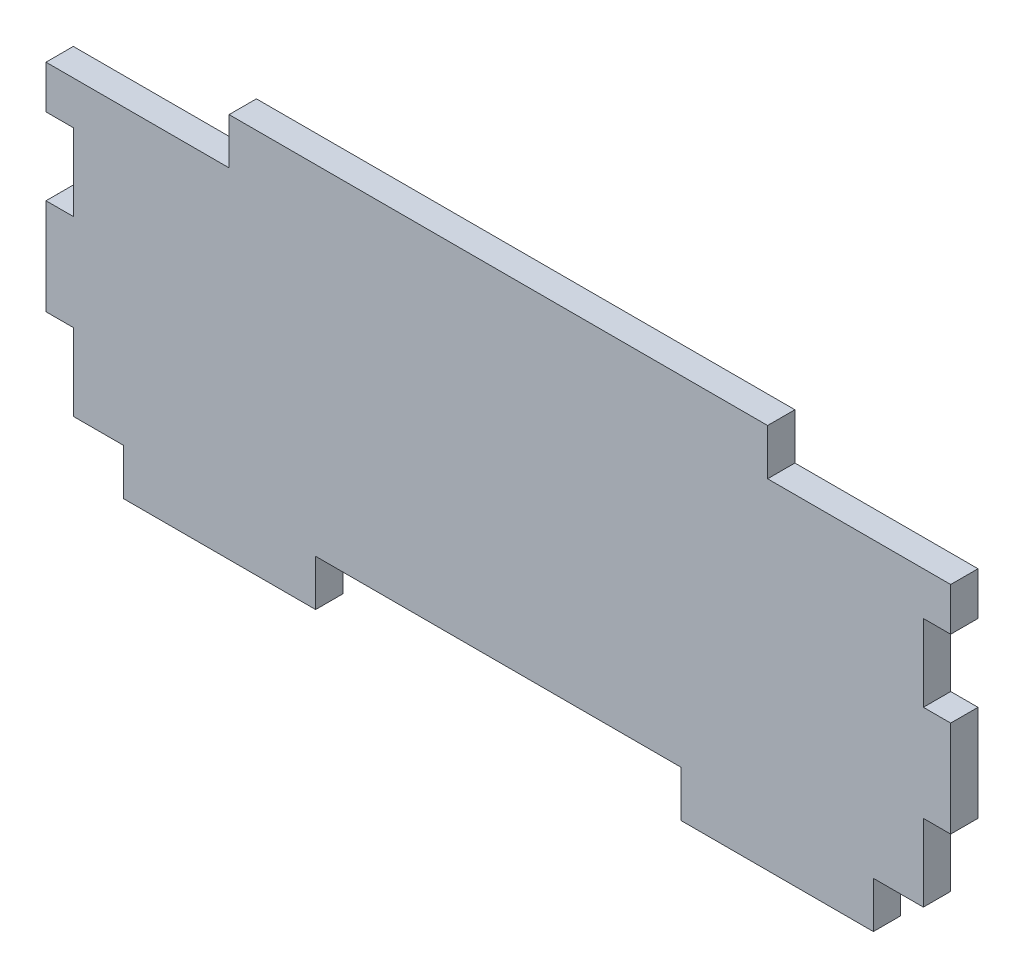
ISO-10303-21;
HEADER;
FILE_DESCRIPTION(('STEP AP214'),'2;1');
FILE_NAME('part.step','',(''),(''),'','','');
FILE_SCHEMA(('AUTOMOTIVE_DESIGN { 1 0 10303 214 1 1 1 1 }'));
ENDSEC;
DATA;
#1=APPLICATION_CONTEXT('core data for automotive mechanical design processes');
#2=APPLICATION_PROTOCOL_DEFINITION('international standard','automotive_design',2000,#1);
#3=PRODUCT_CONTEXT('',#1,'mechanical');
#4=PRODUCT('Part','Part','',(#3));
#5=PRODUCT_RELATED_PRODUCT_CATEGORY('part','',(#4));
#6=PRODUCT_DEFINITION_FORMATION('','',#4);
#7=PRODUCT_DEFINITION_CONTEXT('part definition',#1,'design');
#8=PRODUCT_DEFINITION('design','',#6,#7);
#9=PRODUCT_DEFINITION_SHAPE('','',#8);
#10=(LENGTH_UNIT() NAMED_UNIT(*) SI_UNIT(.MILLI.,.METRE.));
#11=(NAMED_UNIT(*) PLANE_ANGLE_UNIT() SI_UNIT($,.RADIAN.));
#12=(NAMED_UNIT(*) SI_UNIT($,.STERADIAN.) SOLID_ANGLE_UNIT());
#13=UNCERTAINTY_MEASURE_WITH_UNIT(LENGTH_MEASURE(1.E-05),#10,'distance_accuracy_value','');
#14=(GEOMETRIC_REPRESENTATION_CONTEXT(3) GLOBAL_UNCERTAINTY_ASSIGNED_CONTEXT((#13)) GLOBAL_UNIT_ASSIGNED_CONTEXT((#10,
#11,#12)) REPRESENTATION_CONTEXT('',''));
#15=CARTESIAN_POINT('',(0.,0.,0.));
#16=DIRECTION('',(0.,0.,1.));
#17=DIRECTION('',(1.,0.,0.));
#18=AXIS2_PLACEMENT_3D('',#15,#16,#17);
#19=CARTESIAN_POINT('',(1.8034,16.1544,1.8034));
#20=DIRECTION('',(-1.,0.,0.));
#21=DIRECTION('',(0.,0.,1.));
#22=AXIS2_PLACEMENT_3D('',#19,#20,#21);
#23=PLANE('',#22);
#24=DIRECTION('',(0.,1.,0.));
#25=VECTOR('',#24,1.);
#26=CARTESIAN_POINT('',(1.8034,16.1544,0.));
#27=LINE('',#26,#25);
#28=CARTESIAN_POINT('',(1.8034,9.8044,0.));
#29=VERTEX_POINT('',#28);
#30=CARTESIAN_POINT('',(1.8034,16.1544,0.));
#31=VERTEX_POINT('',#30);
#32=EDGE_CURVE('E249',#29,#31,#27,.T.);
#33=ORIENTED_EDGE('',*,*,#32,.T.);
#34=DIRECTION('',(0.,0.,-1.));
#35=VECTOR('',#34,1.);
#36=CARTESIAN_POINT('',(1.8034,16.1544,1.8034));
#37=LINE('',#36,#35);
#38=CARTESIAN_POINT('',(1.8034,16.1544,1.8034));
#39=VERTEX_POINT('',#38);
#40=EDGE_CURVE('E11',#39,#31,#37,.T.);
#41=ORIENTED_EDGE('',*,*,#40,.F.);
#42=DIRECTION('',(0.,1.,0.));
#43=VECTOR('',#42,1.);
#44=CARTESIAN_POINT('',(1.8034,16.1544,1.8034));
#45=LINE('',#44,#43);
#46=CARTESIAN_POINT('',(1.8034,9.8044,1.8034));
#47=VERTEX_POINT('',#46);
#48=EDGE_CURVE('E303',#47,#39,#45,.T.);
#49=ORIENTED_EDGE('',*,*,#48,.F.);
#50=DIRECTION('',(0.,0.,-1.));
#51=VECTOR('',#50,1.);
#52=CARTESIAN_POINT('',(1.8034,9.8044,1.8034));
#53=LINE('',#52,#51);
#54=EDGE_CURVE('E245',#47,#29,#53,.T.);
#55=ORIENTED_EDGE('',*,*,#54,.T.);
#56=EDGE_LOOP('',(#33,#41,#49,#55));
#57=FACE_BOUND('',#56,.T.);
#58=ADVANCED_FACE('F33',(#57),#23,.F.);
#59=CARTESIAN_POINT('',(1.8034,16.1544,1.8034));
#60=DIRECTION('',(0.,-1.,0.));
#61=DIRECTION('',(0.,0.,-1.));
#62=AXIS2_PLACEMENT_3D('',#59,#60,#61);
#63=PLANE('',#62);
#64=DIRECTION('',(-1.,0.,0.));
#65=VECTOR('',#64,1.);
#66=CARTESIAN_POINT('',(1.8034,16.1544,0.));
#67=LINE('',#66,#65);
#68=CARTESIAN_POINT('',(0.,16.1544,0.));
#69=VERTEX_POINT('',#68);
#70=EDGE_CURVE('E252',#31,#69,#67,.T.);
#71=ORIENTED_EDGE('',*,*,#70,.T.);
#72=DIRECTION('',(0.,0.,-1.));
#73=VECTOR('',#72,1.);
#74=CARTESIAN_POINT('',(0.,16.1544,1.8034));
#75=LINE('',#74,#73);
#76=CARTESIAN_POINT('',(0.,16.1544,1.8034));
#77=VERTEX_POINT('',#76);
#78=EDGE_CURVE('E41',#77,#69,#75,.T.);
#79=ORIENTED_EDGE('',*,*,#78,.F.);
#80=DIRECTION('',(-1.,0.,0.));
#81=VECTOR('',#80,1.);
#82=CARTESIAN_POINT('',(1.8034,16.1544,1.8034));
#83=LINE('',#82,#81);
#84=EDGE_CURVE('E152',#39,#77,#83,.T.);
#85=ORIENTED_EDGE('',*,*,#84,.F.);
#86=ORIENTED_EDGE('',*,*,#40,.T.);
#87=EDGE_LOOP('',(#71,#79,#85,#86));
#88=FACE_BOUND('',#87,.T.);
#89=ADVANCED_FACE('F461',(#88),#63,.F.);
#90=CARTESIAN_POINT('',(0.,21.2344,1.8034));
#91=DIRECTION('',(-1.,0.,0.));
#92=DIRECTION('',(0.,0.,1.));
#93=AXIS2_PLACEMENT_3D('',#90,#91,#92);
#94=PLANE('',#93);
#95=DIRECTION('',(0.,1.,0.));
#96=VECTOR('',#95,1.);
#97=CARTESIAN_POINT('',(0.,21.2344,0.));
#98=LINE('',#97,#96);
#99=CARTESIAN_POINT('',(0.,21.2344,0.));
#100=VERTEX_POINT('',#99);
#101=EDGE_CURVE('E254',#69,#100,#98,.T.);
#102=ORIENTED_EDGE('',*,*,#101,.T.);
#103=DIRECTION('',(0.,0.,-1.));
#104=VECTOR('',#103,1.);
#105=CARTESIAN_POINT('',(0.,21.2344,1.8034));
#106=LINE('',#105,#104);
#107=CARTESIAN_POINT('',(0.,21.2344,1.8034));
#108=VERTEX_POINT('',#107);
#109=EDGE_CURVE('E370',#108,#100,#106,.T.);
#110=ORIENTED_EDGE('',*,*,#109,.F.);
#111=DIRECTION('',(0.,1.,0.));
#112=VECTOR('',#111,1.);
#113=CARTESIAN_POINT('',(0.,21.2344,1.8034));
#114=LINE('',#113,#112);
#115=EDGE_CURVE('E378',#77,#108,#114,.T.);
#116=ORIENTED_EDGE('',*,*,#115,.F.);
#117=ORIENTED_EDGE('',*,*,#78,.T.);
#118=EDGE_LOOP('',(#102,#110,#116,#117));
#119=FACE_BOUND('',#118,.T.);
#120=ADVANCED_FACE('F376',(#119),#94,.F.);
#121=CARTESIAN_POINT('',(1.8034,21.2344,1.8034));
#122=DIRECTION('',(0.,1.,0.));
#123=DIRECTION('',(0.,0.,1.));
#124=AXIS2_PLACEMENT_3D('',#121,#122,#123);
#125=PLANE('',#124);
#126=DIRECTION('',(1.,0.,0.));
#127=VECTOR('',#126,1.);
#128=CARTESIAN_POINT('',(1.8034,21.2344,0.));
#129=LINE('',#128,#127);
#130=CARTESIAN_POINT('',(1.8034,21.2344,0.));
#131=VERTEX_POINT('',#130);
#132=EDGE_CURVE('E256',#100,#131,#129,.T.);
#133=ORIENTED_EDGE('',*,*,#132,.T.);
#134=DIRECTION('',(0.,0.,-1.));
#135=VECTOR('',#134,1.);
#136=CARTESIAN_POINT('',(1.8034,21.2344,1.8034));
#137=LINE('',#136,#135);
#138=CARTESIAN_POINT('',(1.8034,21.2344,1.8034));
#139=VERTEX_POINT('',#138);
#140=EDGE_CURVE('E367',#139,#131,#137,.T.);
#141=ORIENTED_EDGE('',*,*,#140,.F.);
#142=DIRECTION('',(1.,0.,0.));
#143=VECTOR('',#142,1.);
#144=CARTESIAN_POINT('',(1.8034,21.2344,1.8034));
#145=LINE('',#144,#143);
#146=EDGE_CURVE('E396',#108,#139,#145,.T.);
#147=ORIENTED_EDGE('',*,*,#146,.F.);
#148=ORIENTED_EDGE('',*,*,#109,.T.);
#149=EDGE_LOOP('',(#133,#141,#147,#148));
#150=FACE_BOUND('',#149,.T.);
#151=ADVANCED_FACE('F387',(#150),#125,.F.);
#152=CARTESIAN_POINT('',(1.8034,24.0792,1.8034));
#153=DIRECTION('',(-1.,0.,0.));
#154=DIRECTION('',(0.,0.,1.));
#155=AXIS2_PLACEMENT_3D('',#152,#153,#154);
#156=PLANE('',#155);
#157=DIRECTION('',(0.,1.,0.));
#158=VECTOR('',#157,1.);
#159=CARTESIAN_POINT('',(1.8034,24.0792,0.));
#160=LINE('',#159,#158);
#161=CARTESIAN_POINT('',(1.8034,24.0792,0.));
#162=VERTEX_POINT('',#161);
#163=EDGE_CURVE('E258',#131,#162,#160,.T.);
#164=ORIENTED_EDGE('',*,*,#163,.T.);
#165=DIRECTION('',(0.,0.,-1.));
#166=VECTOR('',#165,1.);
#167=CARTESIAN_POINT('',(1.8034,24.0792,1.8034));
#168=LINE('',#167,#166);
#169=CARTESIAN_POINT('',(1.8034,24.0792,1.8034));
#170=VERTEX_POINT('',#169);
#171=EDGE_CURVE('E364',#170,#162,#168,.T.);
#172=ORIENTED_EDGE('',*,*,#171,.F.);
#173=DIRECTION('',(0.,1.,0.));
#174=VECTOR('',#173,1.);
#175=CARTESIAN_POINT('',(1.8034,24.0792,1.8034));
#176=LINE('',#175,#174);
#177=EDGE_CURVE('E393',#139,#170,#176,.T.);
#178=ORIENTED_EDGE('',*,*,#177,.F.);
#179=ORIENTED_EDGE('',*,*,#140,.T.);
#180=EDGE_LOOP('',(#164,#172,#178,#179));
#181=FACE_BOUND('',#180,.T.);
#182=ADVANCED_FACE('F391',(#181),#156,.F.);
#183=CARTESIAN_POINT('',(1.8034,24.0792,1.8034));
#184=DIRECTION('',(0.,-1.,0.));
#185=DIRECTION('',(0.,0.,-1.));
#186=AXIS2_PLACEMENT_3D('',#183,#184,#185);
#187=PLANE('',#186);
#188=DIRECTION('',(-1.,0.,0.));
#189=VECTOR('',#188,1.);
#190=CARTESIAN_POINT('',(1.8034,24.0792,0.));
#191=LINE('',#190,#189);
#192=CARTESIAN_POINT('',(-10.287,24.0792,0.));
#193=VERTEX_POINT('',#192);
#194=EDGE_CURVE('E260',#162,#193,#191,.T.);
#195=ORIENTED_EDGE('',*,*,#194,.T.);
#196=DIRECTION('',(0.,0.,-1.));
#197=VECTOR('',#196,1.);
#198=CARTESIAN_POINT('',(-10.287,24.0792,1.8034));
#199=LINE('',#198,#197);
#200=CARTESIAN_POINT('',(-10.287,24.0792,1.8034));
#201=VERTEX_POINT('',#200);
#202=EDGE_CURVE('E361',#201,#193,#199,.T.);
#203=ORIENTED_EDGE('',*,*,#202,.F.);
#204=DIRECTION('',(-1.,0.,0.));
#205=VECTOR('',#204,1.);
#206=CARTESIAN_POINT('',(1.8034,24.0792,1.8034));
#207=LINE('',#206,#205);
#208=EDGE_CURVE('E395',#170,#201,#207,.T.);
#209=ORIENTED_EDGE('',*,*,#208,.F.);
#210=ORIENTED_EDGE('',*,*,#171,.T.);
#211=EDGE_LOOP('',(#195,#203,#209,#210));
#212=FACE_BOUND('',#211,.T.);
#213=ADVANCED_FACE('F474',(#212),#187,.F.);
#214=CARTESIAN_POINT('',(-10.287,24.0792,1.8034));
#215=DIRECTION('',(-1.,0.,0.));
#216=DIRECTION('',(0.,-1.,0.));
#217=AXIS2_PLACEMENT_3D('',#214,#215,#216);
#218=PLANE('',#217);
#219=DIRECTION('',(0.,1.,0.));
#220=VECTOR('',#219,1.);
#221=CARTESIAN_POINT('',(-10.287,24.0792,0.));
#222=LINE('',#221,#220);
#223=CARTESIAN_POINT('',(-10.287,27.1272,0.));
#224=VERTEX_POINT('',#223);
#225=EDGE_CURVE('E262',#193,#224,#222,.T.);
#226=ORIENTED_EDGE('',*,*,#225,.T.);
#227=DIRECTION('',(0.,0.,-1.));
#228=VECTOR('',#227,1.);
#229=CARTESIAN_POINT('',(-10.287,27.1272,1.8034));
#230=LINE('',#229,#228);
#231=CARTESIAN_POINT('',(-10.287,27.1272,1.8034));
#232=VERTEX_POINT('',#231);
#233=EDGE_CURVE('E358',#232,#224,#230,.T.);
#234=ORIENTED_EDGE('',*,*,#233,.F.);
#235=DIRECTION('',(0.,1.,0.));
#236=VECTOR('',#235,1.);
#237=CARTESIAN_POINT('',(-10.287,24.0792,1.8034));
#238=LINE('',#237,#236);
#239=EDGE_CURVE('E398',#201,#232,#238,.T.);
#240=ORIENTED_EDGE('',*,*,#239,.F.);
#241=ORIENTED_EDGE('',*,*,#202,.T.);
#242=EDGE_LOOP('',(#226,#234,#240,#241));
#243=FACE_BOUND('',#242,.T.);
#244=ADVANCED_FACE('F477',(#243),#218,.F.);
#245=CARTESIAN_POINT('',(-10.287,27.1272,1.8034));
#246=DIRECTION('',(0.,-1.,0.));
#247=DIRECTION('',(1.,0.,0.));
#248=AXIS2_PLACEMENT_3D('',#245,#246,#247);
#249=PLANE('',#248);
#250=DIRECTION('',(-1.,0.,0.));
#251=VECTOR('',#250,1.);
#252=CARTESIAN_POINT('',(-10.287,27.1272,0.));
#253=LINE('',#252,#251);
#254=CARTESIAN_POINT('',(-45.847,27.1272,0.));
#255=VERTEX_POINT('',#254);
#256=EDGE_CURVE('E264',#224,#255,#253,.T.);
#257=ORIENTED_EDGE('',*,*,#256,.T.);
#258=DIRECTION('',(0.,0.,-1.));
#259=VECTOR('',#258,1.);
#260=CARTESIAN_POINT('',(-45.847,27.1272,1.8034));
#261=LINE('',#260,#259);
#262=CARTESIAN_POINT('',(-45.847,27.1272,1.8034));
#263=VERTEX_POINT('',#262);
#264=EDGE_CURVE('E355',#263,#255,#261,.T.);
#265=ORIENTED_EDGE('',*,*,#264,.F.);
#266=DIRECTION('',(-1.,0.,0.));
#267=VECTOR('',#266,1.);
#268=CARTESIAN_POINT('',(-10.287,27.1272,1.8034));
#269=LINE('',#268,#267);
#270=EDGE_CURVE('E404',#232,#263,#269,.T.);
#271=ORIENTED_EDGE('',*,*,#270,.F.);
#272=ORIENTED_EDGE('',*,*,#233,.T.);
#273=EDGE_LOOP('',(#257,#265,#271,#272));
#274=FACE_BOUND('',#273,.T.);
#275=ADVANCED_FACE('F481',(#274),#249,.F.);
#276=CARTESIAN_POINT('',(-45.847,27.1272,1.8034));
#277=DIRECTION('',(1.,0.,0.));
#278=DIRECTION('',(0.,1.,0.));
#279=AXIS2_PLACEMENT_3D('',#276,#277,#278);
#280=PLANE('',#279);
#281=DIRECTION('',(0.,-1.,0.));
#282=VECTOR('',#281,1.);
#283=CARTESIAN_POINT('',(-45.847,27.1272,0.));
#284=LINE('',#283,#282);
#285=CARTESIAN_POINT('',(-45.847,24.0792,0.));
#286=VERTEX_POINT('',#285);
#287=EDGE_CURVE('E266',#255,#286,#284,.T.);
#288=ORIENTED_EDGE('',*,*,#287,.T.);
#289=DIRECTION('',(0.,0.,-1.));
#290=VECTOR('',#289,1.);
#291=CARTESIAN_POINT('',(-45.847,24.0792,1.8034));
#292=LINE('',#291,#290);
#293=CARTESIAN_POINT('',(-45.847,24.0792,1.8034));
#294=VERTEX_POINT('',#293);
#295=EDGE_CURVE('E352',#294,#286,#292,.T.);
#296=ORIENTED_EDGE('',*,*,#295,.F.);
#297=DIRECTION('',(0.,-1.,0.));
#298=VECTOR('',#297,1.);
#299=CARTESIAN_POINT('',(-45.847,27.1272,1.8034));
#300=LINE('',#299,#298);
#301=EDGE_CURVE('E406',#263,#294,#300,.T.);
#302=ORIENTED_EDGE('',*,*,#301,.F.);
#303=ORIENTED_EDGE('',*,*,#264,.T.);
#304=EDGE_LOOP('',(#288,#296,#302,#303));
#305=FACE_BOUND('',#304,.T.);
#306=ADVANCED_FACE('F485',(#305),#280,.F.);
#307=CARTESIAN_POINT('',(-45.847,24.0792,1.8034));
#308=DIRECTION('',(0.,-1.,0.));
#309=DIRECTION('',(1.,0.,0.));
#310=AXIS2_PLACEMENT_3D('',#307,#308,#309);
#311=PLANE('',#310);
#312=DIRECTION('',(-1.,0.,0.));
#313=VECTOR('',#312,1.);
#314=CARTESIAN_POINT('',(-45.847,24.0792,0.));
#315=LINE('',#314,#313);
#316=CARTESIAN_POINT('',(-57.9374,24.0792,0.));
#317=VERTEX_POINT('',#316);
#318=EDGE_CURVE('E268',#286,#317,#315,.T.);
#319=ORIENTED_EDGE('',*,*,#318,.T.);
#320=DIRECTION('',(0.,0.,-1.));
#321=VECTOR('',#320,1.);
#322=CARTESIAN_POINT('',(-57.9374,24.0792,1.8034));
#323=LINE('',#322,#321);
#324=CARTESIAN_POINT('',(-57.9374,24.0792,1.8034));
#325=VERTEX_POINT('',#324);
#326=EDGE_CURVE('E349',#325,#317,#323,.T.);
#327=ORIENTED_EDGE('',*,*,#326,.F.);
#328=DIRECTION('',(-1.,0.,0.));
#329=VECTOR('',#328,1.);
#330=CARTESIAN_POINT('',(-45.847,24.0792,1.8034));
#331=LINE('',#330,#329);
#332=EDGE_CURVE('E408',#294,#325,#331,.T.);
#333=ORIENTED_EDGE('',*,*,#332,.F.);
#334=ORIENTED_EDGE('',*,*,#295,.T.);
#335=EDGE_LOOP('',(#319,#327,#333,#334));
#336=FACE_BOUND('',#335,.T.);
#337=ADVANCED_FACE('F489',(#336),#311,.F.);
#338=CARTESIAN_POINT('',(-57.9374,24.0792,1.8034));
#339=DIRECTION('',(1.,0.,0.));
#340=DIRECTION('',(0.,0.,-1.));
#341=AXIS2_PLACEMENT_3D('',#338,#339,#340);
#342=PLANE('',#341);
#343=DIRECTION('',(0.,-1.,0.));
#344=VECTOR('',#343,1.);
#345=CARTESIAN_POINT('',(-57.9374,24.0792,0.));
#346=LINE('',#345,#344);
#347=CARTESIAN_POINT('',(-57.9374,21.2344,0.));
#348=VERTEX_POINT('',#347);
#349=EDGE_CURVE('E270',#317,#348,#346,.T.);
#350=ORIENTED_EDGE('',*,*,#349,.T.);
#351=DIRECTION('',(0.,0.,-1.));
#352=VECTOR('',#351,1.);
#353=CARTESIAN_POINT('',(-57.9374,21.2344,1.8034));
#354=LINE('',#353,#352);
#355=CARTESIAN_POINT('',(-57.9374,21.2344,1.8034));
#356=VERTEX_POINT('',#355);
#357=EDGE_CURVE('E346',#356,#348,#354,.T.);
#358=ORIENTED_EDGE('',*,*,#357,.F.);
#359=DIRECTION('',(0.,-1.,0.));
#360=VECTOR('',#359,1.);
#361=CARTESIAN_POINT('',(-57.9374,24.0792,1.8034));
#362=LINE('',#361,#360);
#363=EDGE_CURVE('E410',#325,#356,#362,.T.);
#364=ORIENTED_EDGE('',*,*,#363,.F.);
#365=ORIENTED_EDGE('',*,*,#326,.T.);
#366=EDGE_LOOP('',(#350,#358,#364,#365));
#367=FACE_BOUND('',#366,.T.);
#368=ADVANCED_FACE('F493',(#367),#342,.F.);
#369=CARTESIAN_POINT('',(-57.9374,21.2344,1.8034));
#370=DIRECTION('',(0.,1.,0.));
#371=DIRECTION('',(0.,0.,1.));
#372=AXIS2_PLACEMENT_3D('',#369,#370,#371);
#373=PLANE('',#372);
#374=DIRECTION('',(1.,0.,0.));
#375=VECTOR('',#374,1.);
#376=CARTESIAN_POINT('',(-57.9374,21.2344,0.));
#377=LINE('',#376,#375);
#378=CARTESIAN_POINT('',(-56.134,21.2344,0.));
#379=VERTEX_POINT('',#378);
#380=EDGE_CURVE('E272',#348,#379,#377,.T.);
#381=ORIENTED_EDGE('',*,*,#380,.T.);
#382=DIRECTION('',(0.,0.,-1.));
#383=VECTOR('',#382,1.);
#384=CARTESIAN_POINT('',(-56.134,21.2344,1.8034));
#385=LINE('',#384,#383);
#386=CARTESIAN_POINT('',(-56.134,21.2344,1.8034));
#387=VERTEX_POINT('',#386);
#388=EDGE_CURVE('E343',#387,#379,#385,.T.);
#389=ORIENTED_EDGE('',*,*,#388,.F.);
#390=DIRECTION('',(1.,0.,0.));
#391=VECTOR('',#390,1.);
#392=CARTESIAN_POINT('',(-57.9374,21.2344,1.8034));
#393=LINE('',#392,#391);
#394=EDGE_CURVE('E412',#356,#387,#393,.T.);
#395=ORIENTED_EDGE('',*,*,#394,.F.);
#396=ORIENTED_EDGE('',*,*,#357,.T.);
#397=EDGE_LOOP('',(#381,#389,#395,#396));
#398=FACE_BOUND('',#397,.T.);
#399=ADVANCED_FACE('F497',(#398),#373,.F.);
#400=CARTESIAN_POINT('',(-56.134,21.2344,1.8034));
#401=DIRECTION('',(1.,0.,0.));
#402=DIRECTION('',(0.,0.,-1.));
#403=AXIS2_PLACEMENT_3D('',#400,#401,#402);
#404=PLANE('',#403);
#405=DIRECTION('',(0.,-1.,0.));
#406=VECTOR('',#405,1.);
#407=CARTESIAN_POINT('',(-56.134,21.2344,0.));
#408=LINE('',#407,#406);
#409=CARTESIAN_POINT('',(-56.134,16.1544,0.));
#410=VERTEX_POINT('',#409);
#411=EDGE_CURVE('E274',#379,#410,#408,.T.);
#412=ORIENTED_EDGE('',*,*,#411,.T.);
#413=DIRECTION('',(0.,0.,-1.));
#414=VECTOR('',#413,1.);
#415=CARTESIAN_POINT('',(-56.134,16.1544,1.8034));
#416=LINE('',#415,#414);
#417=CARTESIAN_POINT('',(-56.134,16.1544,1.8034));
#418=VERTEX_POINT('',#417);
#419=EDGE_CURVE('E340',#418,#410,#416,.T.);
#420=ORIENTED_EDGE('',*,*,#419,.F.);
#421=DIRECTION('',(0.,-1.,0.));
#422=VECTOR('',#421,1.);
#423=CARTESIAN_POINT('',(-56.134,21.2344,1.8034));
#424=LINE('',#423,#422);
#425=EDGE_CURVE('E414',#387,#418,#424,.T.);
#426=ORIENTED_EDGE('',*,*,#425,.F.);
#427=ORIENTED_EDGE('',*,*,#388,.T.);
#428=EDGE_LOOP('',(#412,#420,#426,#427));
#429=FACE_BOUND('',#428,.T.);
#430=ADVANCED_FACE('F501',(#429),#404,.F.);
#431=CARTESIAN_POINT('',(-57.9374,16.1544,1.8034));
#432=DIRECTION('',(0.,-1.,0.));
#433=DIRECTION('',(0.,0.,-1.));
#434=AXIS2_PLACEMENT_3D('',#431,#432,#433);
#435=PLANE('',#434);
#436=DIRECTION('',(-1.,0.,0.));
#437=VECTOR('',#436,1.);
#438=CARTESIAN_POINT('',(-57.9374,16.1544,0.));
#439=LINE('',#438,#437);
#440=CARTESIAN_POINT('',(-57.9374,16.1544,0.));
#441=VERTEX_POINT('',#440);
#442=EDGE_CURVE('E276',#410,#441,#439,.T.);
#443=ORIENTED_EDGE('',*,*,#442,.T.);
#444=DIRECTION('',(0.,0.,-1.));
#445=VECTOR('',#444,1.);
#446=CARTESIAN_POINT('',(-57.9374,16.1544,1.8034));
#447=LINE('',#446,#445);
#448=CARTESIAN_POINT('',(-57.9374,16.1544,1.8034));
#449=VERTEX_POINT('',#448);
#450=EDGE_CURVE('E337',#449,#441,#447,.T.);
#451=ORIENTED_EDGE('',*,*,#450,.F.);
#452=DIRECTION('',(-1.,0.,0.));
#453=VECTOR('',#452,1.);
#454=CARTESIAN_POINT('',(-57.9374,16.1544,1.8034));
#455=LINE('',#454,#453);
#456=EDGE_CURVE('E416',#418,#449,#455,.T.);
#457=ORIENTED_EDGE('',*,*,#456,.F.);
#458=ORIENTED_EDGE('',*,*,#419,.T.);
#459=EDGE_LOOP('',(#443,#451,#457,#458));
#460=FACE_BOUND('',#459,.T.);
#461=ADVANCED_FACE('F505',(#460),#435,.F.);
#462=CARTESIAN_POINT('',(-57.9374,16.1544,1.8034));
#463=DIRECTION('',(1.,0.,0.));
#464=DIRECTION('',(0.,1.,0.));
#465=AXIS2_PLACEMENT_3D('',#462,#463,#464);
#466=PLANE('',#465);
#467=DIRECTION('',(0.,-1.,0.));
#468=VECTOR('',#467,1.);
#469=CARTESIAN_POINT('',(-57.9374,16.1544,0.));
#470=LINE('',#469,#468);
#471=CARTESIAN_POINT('',(-57.9374,9.80439999999999,0.));
#472=VERTEX_POINT('',#471);
#473=EDGE_CURVE('E278',#441,#472,#470,.T.);
#474=ORIENTED_EDGE('',*,*,#473,.T.);
#475=DIRECTION('',(0.,0.,-1.));
#476=VECTOR('',#475,1.);
#477=CARTESIAN_POINT('',(-57.9374,9.80439999999999,1.8034));
#478=LINE('',#477,#476);
#479=CARTESIAN_POINT('',(-57.9374,9.80439999999999,1.8034));
#480=VERTEX_POINT('',#479);
#481=EDGE_CURVE('E334',#480,#472,#478,.T.);
#482=ORIENTED_EDGE('',*,*,#481,.F.);
#483=DIRECTION('',(0.,-1.,0.));
#484=VECTOR('',#483,1.);
#485=CARTESIAN_POINT('',(-57.9374,16.1544,1.8034));
#486=LINE('',#485,#484);
#487=EDGE_CURVE('E418',#449,#480,#486,.T.);
#488=ORIENTED_EDGE('',*,*,#487,.F.);
#489=ORIENTED_EDGE('',*,*,#450,.T.);
#490=EDGE_LOOP('',(#474,#482,#488,#489));
#491=FACE_BOUND('',#490,.T.);
#492=ADVANCED_FACE('F509',(#491),#466,.F.);
#493=CARTESIAN_POINT('',(-57.9374,9.80439999999999,1.8034));
#494=DIRECTION('',(0.,1.,0.));
#495=DIRECTION('',(0.,0.,1.));
#496=AXIS2_PLACEMENT_3D('',#493,#494,#495);
#497=PLANE('',#496);
#498=DIRECTION('',(1.,0.,0.));
#499=VECTOR('',#498,1.);
#500=CARTESIAN_POINT('',(-57.9374,9.80439999999999,0.));
#501=LINE('',#500,#499);
#502=CARTESIAN_POINT('',(-56.134,9.80439999999999,0.));
#503=VERTEX_POINT('',#502);
#504=EDGE_CURVE('E280',#472,#503,#501,.T.);
#505=ORIENTED_EDGE('',*,*,#504,.T.);
#506=DIRECTION('',(0.,0.,-1.));
#507=VECTOR('',#506,1.);
#508=CARTESIAN_POINT('',(-56.134,9.80439999999999,1.8034));
#509=LINE('',#508,#507);
#510=CARTESIAN_POINT('',(-56.134,9.80439999999999,1.8034));
#511=VERTEX_POINT('',#510);
#512=EDGE_CURVE('E331',#511,#503,#509,.T.);
#513=ORIENTED_EDGE('',*,*,#512,.F.);
#514=DIRECTION('',(1.,0.,0.));
#515=VECTOR('',#514,1.);
#516=CARTESIAN_POINT('',(-57.9374,9.80439999999999,1.8034));
#517=LINE('',#516,#515);
#518=EDGE_CURVE('E420',#480,#511,#517,.T.);
#519=ORIENTED_EDGE('',*,*,#518,.F.);
#520=ORIENTED_EDGE('',*,*,#481,.T.);
#521=EDGE_LOOP('',(#505,#513,#519,#520));
#522=FACE_BOUND('',#521,.T.);
#523=ADVANCED_FACE('F513',(#522),#497,.F.);
#524=CARTESIAN_POINT('',(-56.134,9.80439999999999,1.8034));
#525=DIRECTION('',(1.,0.,0.));
#526=DIRECTION('',(0.,0.,-1.));
#527=AXIS2_PLACEMENT_3D('',#524,#525,#526);
#528=PLANE('',#527);
#529=DIRECTION('',(0.,-1.,0.));
#530=VECTOR('',#529,1.);
#531=CARTESIAN_POINT('',(-56.134,9.80439999999999,0.));
#532=LINE('',#531,#530);
#533=CARTESIAN_POINT('',(-56.134,4.72439999999999,0.));
#534=VERTEX_POINT('',#533);
#535=EDGE_CURVE('E282',#503,#534,#532,.T.);
#536=ORIENTED_EDGE('',*,*,#535,.T.);
#537=DIRECTION('',(0.,0.,-1.));
#538=VECTOR('',#537,1.);
#539=CARTESIAN_POINT('',(-56.134,4.72439999999999,1.8034));
#540=LINE('',#539,#538);
#541=CARTESIAN_POINT('',(-56.134,4.72439999999999,1.8034));
#542=VERTEX_POINT('',#541);
#543=EDGE_CURVE('E328',#542,#534,#540,.T.);
#544=ORIENTED_EDGE('',*,*,#543,.F.);
#545=DIRECTION('',(0.,-1.,0.));
#546=VECTOR('',#545,1.);
#547=CARTESIAN_POINT('',(-56.134,9.80439999999999,1.8034));
#548=LINE('',#547,#546);
#549=EDGE_CURVE('E422',#511,#542,#548,.T.);
#550=ORIENTED_EDGE('',*,*,#549,.F.);
#551=ORIENTED_EDGE('',*,*,#512,.T.);
#552=EDGE_LOOP('',(#536,#544,#550,#551));
#553=FACE_BOUND('',#552,.T.);
#554=ADVANCED_FACE('F517',(#553),#528,.F.);
#555=CARTESIAN_POINT('',(-52.832,4.72439999999999,1.8034));
#556=DIRECTION('',(0.,1.,0.));
#557=DIRECTION('',(0.,0.,1.));
#558=AXIS2_PLACEMENT_3D('',#555,#556,#557);
#559=PLANE('',#558);
#560=DIRECTION('',(1.,0.,0.));
#561=VECTOR('',#560,1.);
#562=CARTESIAN_POINT('',(-52.832,4.72439999999999,0.));
#563=LINE('',#562,#561);
#564=CARTESIAN_POINT('',(-52.832,4.72439999999999,0.));
#565=VERTEX_POINT('',#564);
#566=EDGE_CURVE('E284',#534,#565,#563,.T.);
#567=ORIENTED_EDGE('',*,*,#566,.T.);
#568=DIRECTION('',(0.,0.,-1.));
#569=VECTOR('',#568,1.);
#570=CARTESIAN_POINT('',(-52.832,4.72439999999999,1.8034));
#571=LINE('',#570,#569);
#572=CARTESIAN_POINT('',(-52.832,4.72439999999999,1.8034));
#573=VERTEX_POINT('',#572);
#574=EDGE_CURVE('E325',#573,#565,#571,.T.);
#575=ORIENTED_EDGE('',*,*,#574,.F.);
#576=DIRECTION('',(1.,0.,0.));
#577=VECTOR('',#576,1.);
#578=CARTESIAN_POINT('',(-52.832,4.72439999999999,1.8034));
#579=LINE('',#578,#577);
#580=EDGE_CURVE('E424',#542,#573,#579,.T.);
#581=ORIENTED_EDGE('',*,*,#580,.F.);
#582=ORIENTED_EDGE('',*,*,#543,.T.);
#583=EDGE_LOOP('',(#567,#575,#581,#582));
#584=FACE_BOUND('',#583,.T.);
#585=ADVANCED_FACE('F521',(#584),#559,.F.);
#586=CARTESIAN_POINT('',(-52.832,1.67639999999999,1.8034));
#587=DIRECTION('',(1.,0.,0.));
#588=DIRECTION('',(0.,0.,-1.));
#589=AXIS2_PLACEMENT_3D('',#586,#587,#588);
#590=PLANE('',#589);
#591=DIRECTION('',(0.,-1.,0.));
#592=VECTOR('',#591,1.);
#593=CARTESIAN_POINT('',(-52.832,1.67639999999999,0.));
#594=LINE('',#593,#592);
#595=CARTESIAN_POINT('',(-52.832,1.67639999999999,0.));
#596=VERTEX_POINT('',#595);
#597=EDGE_CURVE('E286',#565,#596,#594,.T.);
#598=ORIENTED_EDGE('',*,*,#597,.T.);
#599=DIRECTION('',(0.,0.,-1.));
#600=VECTOR('',#599,1.);
#601=CARTESIAN_POINT('',(-52.832,1.67639999999999,1.8034));
#602=LINE('',#601,#600);
#603=CARTESIAN_POINT('',(-52.832,1.67639999999999,1.8034));
#604=VERTEX_POINT('',#603);
#605=EDGE_CURVE('E322',#604,#596,#602,.T.);
#606=ORIENTED_EDGE('',*,*,#605,.F.);
#607=DIRECTION('',(0.,-1.,0.));
#608=VECTOR('',#607,1.);
#609=CARTESIAN_POINT('',(-52.832,1.67639999999999,1.8034));
#610=LINE('',#609,#608);
#611=EDGE_CURVE('E426',#573,#604,#610,.T.);
#612=ORIENTED_EDGE('',*,*,#611,.F.);
#613=ORIENTED_EDGE('',*,*,#574,.T.);
#614=EDGE_LOOP('',(#598,#606,#612,#613));
#615=FACE_BOUND('',#614,.T.);
#616=ADVANCED_FACE('F525',(#615),#590,.F.);
#617=CARTESIAN_POINT('',(-40.132,1.6764,1.8034));
#618=DIRECTION('',(0.,1.,0.));
#619=DIRECTION('',(-1.,0.,0.));
#620=AXIS2_PLACEMENT_3D('',#617,#618,#619);
#621=PLANE('',#620);
#622=DIRECTION('',(1.,0.,0.));
#623=VECTOR('',#622,1.);
#624=CARTESIAN_POINT('',(-40.132,1.6764,0.));
#625=LINE('',#624,#623);
#626=CARTESIAN_POINT('',(-40.132,1.6764,0.));
#627=VERTEX_POINT('',#626);
#628=EDGE_CURVE('E288',#596,#627,#625,.T.);
#629=ORIENTED_EDGE('',*,*,#628,.T.);
#630=DIRECTION('',(0.,0.,-1.));
#631=VECTOR('',#630,1.);
#632=CARTESIAN_POINT('',(-40.132,1.6764,1.8034));
#633=LINE('',#632,#631);
#634=CARTESIAN_POINT('',(-40.132,1.6764,1.8034));
#635=VERTEX_POINT('',#634);
#636=EDGE_CURVE('E319',#635,#627,#633,.T.);
#637=ORIENTED_EDGE('',*,*,#636,.F.);
#638=DIRECTION('',(1.,0.,0.));
#639=VECTOR('',#638,1.);
#640=CARTESIAN_POINT('',(-40.132,1.6764,1.8034));
#641=LINE('',#640,#639);
#642=EDGE_CURVE('E428',#604,#635,#641,.T.);
#643=ORIENTED_EDGE('',*,*,#642,.F.);
#644=ORIENTED_EDGE('',*,*,#605,.T.);
#645=EDGE_LOOP('',(#629,#637,#643,#644));
#646=FACE_BOUND('',#645,.T.);
#647=ADVANCED_FACE('F529',(#646),#621,.F.);
#648=CARTESIAN_POINT('',(-40.132,4.72439999999999,1.8034));
#649=DIRECTION('',(-1.,0.,0.));
#650=DIRECTION('',(0.,0.,1.));
#651=AXIS2_PLACEMENT_3D('',#648,#649,#650);
#652=PLANE('',#651);
#653=DIRECTION('',(0.,1.,0.));
#654=VECTOR('',#653,1.);
#655=CARTESIAN_POINT('',(-40.132,4.72439999999999,0.));
#656=LINE('',#655,#654);
#657=CARTESIAN_POINT('',(-40.132,4.72439999999999,0.));
#658=VERTEX_POINT('',#657);
#659=EDGE_CURVE('E290',#627,#658,#656,.T.);
#660=ORIENTED_EDGE('',*,*,#659,.T.);
#661=DIRECTION('',(0.,0.,-1.));
#662=VECTOR('',#661,1.);
#663=CARTESIAN_POINT('',(-40.132,4.72439999999999,1.8034));
#664=LINE('',#663,#662);
#665=CARTESIAN_POINT('',(-40.132,4.72439999999999,1.8034));
#666=VERTEX_POINT('',#665);
#667=EDGE_CURVE('E316',#666,#658,#664,.T.);
#668=ORIENTED_EDGE('',*,*,#667,.F.);
#669=DIRECTION('',(0.,1.,0.));
#670=VECTOR('',#669,1.);
#671=CARTESIAN_POINT('',(-40.132,4.72439999999999,1.8034));
#672=LINE('',#671,#670);
#673=EDGE_CURVE('E430',#635,#666,#672,.T.);
#674=ORIENTED_EDGE('',*,*,#673,.F.);
#675=ORIENTED_EDGE('',*,*,#636,.T.);
#676=EDGE_LOOP('',(#660,#668,#674,#675));
#677=FACE_BOUND('',#676,.T.);
#678=ADVANCED_FACE('F533',(#677),#652,.F.);
#679=CARTESIAN_POINT('',(-16.002,4.7244,1.8034));
#680=DIRECTION('',(0.,1.,0.));
#681=DIRECTION('',(-1.,0.,0.));
#682=AXIS2_PLACEMENT_3D('',#679,#680,#681);
#683=PLANE('',#682);
#684=DIRECTION('',(1.,0.,0.));
#685=VECTOR('',#684,1.);
#686=CARTESIAN_POINT('',(-16.002,4.7244,0.));
#687=LINE('',#686,#685);
#688=CARTESIAN_POINT('',(-16.002,4.7244,0.));
#689=VERTEX_POINT('',#688);
#690=EDGE_CURVE('E292',#658,#689,#687,.T.);
#691=ORIENTED_EDGE('',*,*,#690,.T.);
#692=DIRECTION('',(0.,0.,-1.));
#693=VECTOR('',#692,1.);
#694=CARTESIAN_POINT('',(-16.002,4.7244,1.8034));
#695=LINE('',#694,#693);
#696=CARTESIAN_POINT('',(-16.002,4.7244,1.8034));
#697=VERTEX_POINT('',#696);
#698=EDGE_CURVE('E313',#697,#689,#695,.T.);
#699=ORIENTED_EDGE('',*,*,#698,.F.);
#700=DIRECTION('',(1.,0.,0.));
#701=VECTOR('',#700,1.);
#702=CARTESIAN_POINT('',(-16.002,4.7244,1.8034));
#703=LINE('',#702,#701);
#704=EDGE_CURVE('E432',#666,#697,#703,.T.);
#705=ORIENTED_EDGE('',*,*,#704,.F.);
#706=ORIENTED_EDGE('',*,*,#667,.T.);
#707=EDGE_LOOP('',(#691,#699,#705,#706));
#708=FACE_BOUND('',#707,.T.);
#709=ADVANCED_FACE('F537',(#708),#683,.F.);
#710=CARTESIAN_POINT('',(-16.002,1.6764,1.8034));
#711=DIRECTION('',(1.,0.,0.));
#712=DIRECTION('',(0.,1.,0.));
#713=AXIS2_PLACEMENT_3D('',#710,#711,#712);
#714=PLANE('',#713);
#715=DIRECTION('',(0.,-1.,0.));
#716=VECTOR('',#715,1.);
#717=CARTESIAN_POINT('',(-16.002,1.6764,0.));
#718=LINE('',#717,#716);
#719=CARTESIAN_POINT('',(-16.002,1.6764,0.));
#720=VERTEX_POINT('',#719);
#721=EDGE_CURVE('E294',#689,#720,#718,.T.);
#722=ORIENTED_EDGE('',*,*,#721,.T.);
#723=DIRECTION('',(0.,0.,-1.));
#724=VECTOR('',#723,1.);
#725=CARTESIAN_POINT('',(-16.002,1.6764,1.8034));
#726=LINE('',#725,#724);
#727=CARTESIAN_POINT('',(-16.002,1.6764,1.8034));
#728=VERTEX_POINT('',#727);
#729=EDGE_CURVE('E310',#728,#720,#726,.T.);
#730=ORIENTED_EDGE('',*,*,#729,.F.);
#731=DIRECTION('',(0.,-1.,0.));
#732=VECTOR('',#731,1.);
#733=CARTESIAN_POINT('',(-16.002,1.6764,1.8034));
#734=LINE('',#733,#732);
#735=EDGE_CURVE('E434',#697,#728,#734,.T.);
#736=ORIENTED_EDGE('',*,*,#735,.F.);
#737=ORIENTED_EDGE('',*,*,#698,.T.);
#738=EDGE_LOOP('',(#722,#730,#736,#737));
#739=FACE_BOUND('',#738,.T.);
#740=ADVANCED_FACE('F541',(#739),#714,.F.);
#741=CARTESIAN_POINT('',(-3.302,1.6764,1.8034));
#742=DIRECTION('',(0.,1.,0.));
#743=DIRECTION('',(-1.,0.,0.));
#744=AXIS2_PLACEMENT_3D('',#741,#742,#743);
#745=PLANE('',#744);
#746=DIRECTION('',(1.,0.,0.));
#747=VECTOR('',#746,1.);
#748=CARTESIAN_POINT('',(-3.302,1.6764,0.));
#749=LINE('',#748,#747);
#750=CARTESIAN_POINT('',(-3.302,1.6764,0.));
#751=VERTEX_POINT('',#750);
#752=EDGE_CURVE('E296',#720,#751,#749,.T.);
#753=ORIENTED_EDGE('',*,*,#752,.T.);
#754=DIRECTION('',(0.,0.,-1.));
#755=VECTOR('',#754,1.);
#756=CARTESIAN_POINT('',(-3.302,1.6764,1.8034));
#757=LINE('',#756,#755);
#758=CARTESIAN_POINT('',(-3.302,1.6764,1.8034));
#759=VERTEX_POINT('',#758);
#760=EDGE_CURVE('E307',#759,#751,#757,.T.);
#761=ORIENTED_EDGE('',*,*,#760,.F.);
#762=DIRECTION('',(1.,0.,0.));
#763=VECTOR('',#762,1.);
#764=CARTESIAN_POINT('',(-3.302,1.6764,1.8034));
#765=LINE('',#764,#763);
#766=EDGE_CURVE('E436',#728,#759,#765,.T.);
#767=ORIENTED_EDGE('',*,*,#766,.F.);
#768=ORIENTED_EDGE('',*,*,#729,.T.);
#769=EDGE_LOOP('',(#753,#761,#767,#768));
#770=FACE_BOUND('',#769,.T.);
#771=ADVANCED_FACE('F442',(#770),#745,.F.);
#772=CARTESIAN_POINT('',(-3.302,4.7244,1.8034));
#773=DIRECTION('',(-1.,0.,0.));
#774=DIRECTION('',(0.,-1.,0.));
#775=AXIS2_PLACEMENT_3D('',#772,#773,#774);
#776=PLANE('',#775);
#777=DIRECTION('',(0.,1.,0.));
#778=VECTOR('',#777,1.);
#779=CARTESIAN_POINT('',(-3.302,4.7244,0.));
#780=LINE('',#779,#778);
#781=CARTESIAN_POINT('',(-3.302,4.7244,0.));
#782=VERTEX_POINT('',#781);
#783=EDGE_CURVE('E298',#751,#782,#780,.T.);
#784=ORIENTED_EDGE('',*,*,#783,.T.);
#785=DIRECTION('',(0.,0.,-1.));
#786=VECTOR('',#785,1.);
#787=CARTESIAN_POINT('',(-3.302,4.7244,1.8034));
#788=LINE('',#787,#786);
#789=CARTESIAN_POINT('',(-3.302,4.7244,1.8034));
#790=VERTEX_POINT('',#789);
#791=EDGE_CURVE('E240',#790,#782,#788,.T.);
#792=ORIENTED_EDGE('',*,*,#791,.F.);
#793=DIRECTION('',(0.,1.,0.));
#794=VECTOR('',#793,1.);
#795=CARTESIAN_POINT('',(-3.302,4.7244,1.8034));
#796=LINE('',#795,#794);
#797=EDGE_CURVE('E231',#759,#790,#796,.T.);
#798=ORIENTED_EDGE('',*,*,#797,.F.);
#799=ORIENTED_EDGE('',*,*,#760,.T.);
#800=EDGE_LOOP('',(#784,#792,#798,#799));
#801=FACE_BOUND('',#800,.T.);
#802=ADVANCED_FACE('F446',(#801),#776,.F.);
#803=CARTESIAN_POINT('',(0.,4.7244,1.8034));
#804=DIRECTION('',(0.,1.,0.));
#805=DIRECTION('',(-1.,0.,0.));
#806=AXIS2_PLACEMENT_3D('',#803,#804,#805);
#807=PLANE('',#806);
#808=DIRECTION('',(1.,0.,0.));
#809=VECTOR('',#808,1.);
#810=CARTESIAN_POINT('',(0.,4.7244,0.));
#811=LINE('',#810,#809);
#812=CARTESIAN_POINT('',(0.,4.7244,0.));
#813=VERTEX_POINT('',#812);
#814=EDGE_CURVE('E239',#782,#813,#811,.T.);
#815=ORIENTED_EDGE('',*,*,#814,.T.);
#816=DIRECTION('',(0.,0.,-1.));
#817=VECTOR('',#816,1.);
#818=CARTESIAN_POINT('',(0.,4.7244,1.8034));
#819=LINE('',#818,#817);
#820=CARTESIAN_POINT('',(0.,4.7244,1.8034));
#821=VERTEX_POINT('',#820);
#822=EDGE_CURVE('E236',#821,#813,#819,.T.);
#823=ORIENTED_EDGE('',*,*,#822,.F.);
#824=DIRECTION('',(1.,0.,0.));
#825=VECTOR('',#824,1.);
#826=CARTESIAN_POINT('',(0.,4.7244,1.8034));
#827=LINE('',#826,#825);
#828=EDGE_CURVE('E225',#790,#821,#827,.T.);
#829=ORIENTED_EDGE('',*,*,#828,.F.);
#830=ORIENTED_EDGE('',*,*,#791,.T.);
#831=EDGE_LOOP('',(#815,#823,#829,#830));
#832=FACE_BOUND('',#831,.T.);
#833=ADVANCED_FACE('F237',(#832),#807,.F.);
#834=CARTESIAN_POINT('',(0.,9.8044,1.8034));
#835=DIRECTION('',(-1.,0.,0.));
#836=DIRECTION('',(0.,0.,1.));
#837=AXIS2_PLACEMENT_3D('',#834,#835,#836);
#838=PLANE('',#837);
#839=DIRECTION('',(0.,1.,0.));
#840=VECTOR('',#839,1.);
#841=CARTESIAN_POINT('',(0.,9.8044,0.));
#842=LINE('',#841,#840);
#843=CARTESIAN_POINT('',(0.,9.8044,0.));
#844=VERTEX_POINT('',#843);
#845=EDGE_CURVE('E138',#813,#844,#842,.T.);
#846=ORIENTED_EDGE('',*,*,#845,.T.);
#847=DIRECTION('',(0.,0.,-1.));
#848=VECTOR('',#847,1.);
#849=CARTESIAN_POINT('',(0.,9.8044,1.8034));
#850=LINE('',#849,#848);
#851=CARTESIAN_POINT('',(0.,9.8044,1.8034));
#852=VERTEX_POINT('',#851);
#853=EDGE_CURVE('E241',#852,#844,#850,.T.);
#854=ORIENTED_EDGE('',*,*,#853,.F.);
#855=DIRECTION('',(0.,1.,0.));
#856=VECTOR('',#855,1.);
#857=CARTESIAN_POINT('',(0.,9.8044,1.8034));
#858=LINE('',#857,#856);
#859=EDGE_CURVE('E229',#821,#852,#858,.T.);
#860=ORIENTED_EDGE('',*,*,#859,.F.);
#861=ORIENTED_EDGE('',*,*,#822,.T.);
#862=EDGE_LOOP('',(#846,#854,#860,#861));
#863=FACE_BOUND('',#862,.T.);
#864=ADVANCED_FACE('F243',(#863),#838,.F.);
#865=CARTESIAN_POINT('',(1.8034,9.8044,1.8034));
#866=DIRECTION('',(0.,1.,0.));
#867=DIRECTION('',(0.,0.,1.));
#868=AXIS2_PLACEMENT_3D('',#865,#866,#867);
#869=PLANE('',#868);
#870=DIRECTION('',(1.,0.,0.));
#871=VECTOR('',#870,1.);
#872=CARTESIAN_POINT('',(1.8034,9.8044,0.));
#873=LINE('',#872,#871);
#874=EDGE_CURVE('E144',#844,#29,#873,.T.);
#875=ORIENTED_EDGE('',*,*,#874,.T.);
#876=ORIENTED_EDGE('',*,*,#54,.F.);
#877=DIRECTION('',(1.,0.,0.));
#878=VECTOR('',#877,1.);
#879=CARTESIAN_POINT('',(1.8034,9.8044,1.8034));
#880=LINE('',#879,#878);
#881=EDGE_CURVE('E49',#852,#47,#880,.T.);
#882=ORIENTED_EDGE('',*,*,#881,.F.);
#883=ORIENTED_EDGE('',*,*,#853,.T.);
#884=EDGE_LOOP('',(#875,#876,#882,#883));
#885=FACE_BOUND('',#884,.T.);
#886=ADVANCED_FACE('F450',(#885),#869,.F.);
#887=CARTESIAN_POINT('',(0.,0.,1.8034));
#888=DIRECTION('',(0.,0.,-1.));
#889=DIRECTION('',(-1.,0.,0.));
#890=AXIS2_PLACEMENT_3D('',#887,#888,#889);
#891=PLANE('',#890);
#892=ORIENTED_EDGE('',*,*,#48,.T.);
#893=ORIENTED_EDGE('',*,*,#84,.T.);
#894=ORIENTED_EDGE('',*,*,#115,.T.);
#895=ORIENTED_EDGE('',*,*,#146,.T.);
#896=ORIENTED_EDGE('',*,*,#177,.T.);
#897=ORIENTED_EDGE('',*,*,#208,.T.);
#898=ORIENTED_EDGE('',*,*,#239,.T.);
#899=ORIENTED_EDGE('',*,*,#270,.T.);
#900=ORIENTED_EDGE('',*,*,#301,.T.);
#901=ORIENTED_EDGE('',*,*,#332,.T.);
#902=ORIENTED_EDGE('',*,*,#363,.T.);
#903=ORIENTED_EDGE('',*,*,#394,.T.);
#904=ORIENTED_EDGE('',*,*,#425,.T.);
#905=ORIENTED_EDGE('',*,*,#456,.T.);
#906=ORIENTED_EDGE('',*,*,#487,.T.);
#907=ORIENTED_EDGE('',*,*,#518,.T.);
#908=ORIENTED_EDGE('',*,*,#549,.T.);
#909=ORIENTED_EDGE('',*,*,#580,.T.);
#910=ORIENTED_EDGE('',*,*,#611,.T.);
#911=ORIENTED_EDGE('',*,*,#642,.T.);
#912=ORIENTED_EDGE('',*,*,#673,.T.);
#913=ORIENTED_EDGE('',*,*,#704,.T.);
#914=ORIENTED_EDGE('',*,*,#735,.T.);
#915=ORIENTED_EDGE('',*,*,#766,.T.);
#916=ORIENTED_EDGE('',*,*,#797,.T.);
#917=ORIENTED_EDGE('',*,*,#828,.T.);
#918=ORIENTED_EDGE('',*,*,#859,.T.);
#919=ORIENTED_EDGE('',*,*,#881,.T.);
#920=EDGE_LOOP('',(#892,#893,#894,#895,#896,#897,#898,#899,#900,#901,#902,#903,#904,#905,#906,
#907,#908,#909,#910,#911,#912,#913,#914,#915,#916,#917,#918,#919));
#921=FACE_BOUND('',#920,.T.);
#922=ADVANCED_FACE('F227',(#921),#891,.F.);
#923=CARTESIAN_POINT('',(0.,0.,0.));
#924=DIRECTION('',(0.,0.,-1.));
#925=DIRECTION('',(-1.,0.,0.));
#926=AXIS2_PLACEMENT_3D('',#923,#924,#925);
#927=PLANE('',#926);
#928=ORIENTED_EDGE('',*,*,#32,.F.);
#929=ORIENTED_EDGE('',*,*,#874,.F.);
#930=ORIENTED_EDGE('',*,*,#845,.F.);
#931=ORIENTED_EDGE('',*,*,#814,.F.);
#932=ORIENTED_EDGE('',*,*,#783,.F.);
#933=ORIENTED_EDGE('',*,*,#752,.F.);
#934=ORIENTED_EDGE('',*,*,#721,.F.);
#935=ORIENTED_EDGE('',*,*,#690,.F.);
#936=ORIENTED_EDGE('',*,*,#659,.F.);
#937=ORIENTED_EDGE('',*,*,#628,.F.);
#938=ORIENTED_EDGE('',*,*,#597,.F.);
#939=ORIENTED_EDGE('',*,*,#566,.F.);
#940=ORIENTED_EDGE('',*,*,#535,.F.);
#941=ORIENTED_EDGE('',*,*,#504,.F.);
#942=ORIENTED_EDGE('',*,*,#473,.F.);
#943=ORIENTED_EDGE('',*,*,#442,.F.);
#944=ORIENTED_EDGE('',*,*,#411,.F.);
#945=ORIENTED_EDGE('',*,*,#380,.F.);
#946=ORIENTED_EDGE('',*,*,#349,.F.);
#947=ORIENTED_EDGE('',*,*,#318,.F.);
#948=ORIENTED_EDGE('',*,*,#287,.F.);
#949=ORIENTED_EDGE('',*,*,#256,.F.);
#950=ORIENTED_EDGE('',*,*,#225,.F.);
#951=ORIENTED_EDGE('',*,*,#194,.F.);
#952=ORIENTED_EDGE('',*,*,#163,.F.);
#953=ORIENTED_EDGE('',*,*,#132,.F.);
#954=ORIENTED_EDGE('',*,*,#101,.F.);
#955=ORIENTED_EDGE('',*,*,#70,.F.);
#956=EDGE_LOOP('',(#928,#929,#930,#931,#932,#933,#934,#935,#936,#937,#938,#939,#940,#941,#942,
#943,#944,#945,#946,#947,#948,#949,#950,#951,#952,#953,#954,#955));
#957=FACE_BOUND('',#956,.T.);
#958=ADVANCED_FACE('F382',(#957),#927,.T.);
#959=CLOSED_SHELL('',(#58,#89,#120,#151,#182,#213,#244,#275,#306,#337,#368,#399,#430,#461,#492,
#523,#554,#585,#616,#647,#678,#709,#740,#771,#802,#833,#864,#886,#922,#958));
#960=MANIFOLD_SOLID_BREP('B2',#959);
#961=ADVANCED_BREP_SHAPE_REPRESENTATION('',(#18,#960),#14);
#962=SHAPE_DEFINITION_REPRESENTATION(#9,#961);
ENDSEC;
END-ISO-10303-21;
